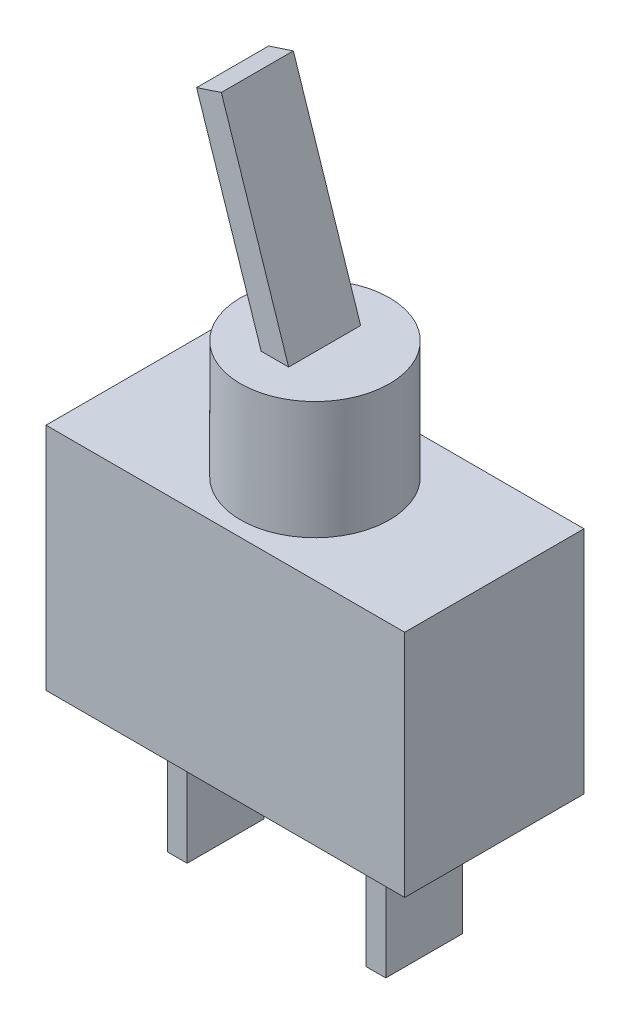
ISO-10303-21;
HEADER;
FILE_DESCRIPTION(('STEP AP214'),'2;1');
FILE_NAME('part.step','',(''),(''),'','','');
FILE_SCHEMA(('AUTOMOTIVE_DESIGN { 1 0 10303 214 1 1 1 1 }'));
ENDSEC;
DATA;
#1=APPLICATION_CONTEXT('core data for automotive mechanical design processes');
#2=APPLICATION_PROTOCOL_DEFINITION('international standard','automotive_design',2000,#1);
#3=PRODUCT_CONTEXT('',#1,'mechanical');
#4=PRODUCT('Part','Part','',(#3));
#5=PRODUCT_RELATED_PRODUCT_CATEGORY('part','',(#4));
#6=PRODUCT_DEFINITION_FORMATION('','',#4);
#7=PRODUCT_DEFINITION_CONTEXT('part definition',#1,'design');
#8=PRODUCT_DEFINITION('design','',#6,#7);
#9=PRODUCT_DEFINITION_SHAPE('','',#8);
#10=(LENGTH_UNIT() NAMED_UNIT(*) SI_UNIT(.MILLI.,.METRE.));
#11=(NAMED_UNIT(*) PLANE_ANGLE_UNIT() SI_UNIT($,.RADIAN.));
#12=(NAMED_UNIT(*) SI_UNIT($,.STERADIAN.) SOLID_ANGLE_UNIT());
#13=UNCERTAINTY_MEASURE_WITH_UNIT(LENGTH_MEASURE(1.E-05),#10,'distance_accuracy_value','');
#14=(GEOMETRIC_REPRESENTATION_CONTEXT(3) GLOBAL_UNCERTAINTY_ASSIGNED_CONTEXT((#13)) GLOBAL_UNIT_ASSIGNED_CONTEXT((#10,
#11,#12)) REPRESENTATION_CONTEXT('',''));
#15=CARTESIAN_POINT('',(0.,0.,0.));
#16=DIRECTION('',(0.,0.,1.));
#17=DIRECTION('',(1.,0.,0.));
#18=AXIS2_PLACEMENT_3D('',#15,#16,#17);
#19=CARTESIAN_POINT('',(-14.445,-9.25,7.22));
#20=DIRECTION('',(0.,1.,0.));
#21=DIRECTION('',(0.,0.,1.));
#22=AXIS2_PLACEMENT_3D('',#19,#20,#21);
#23=PLANE('',#22);
#24=DIRECTION('',(-1.,0.,0.));
#25=VECTOR('',#24,1.);
#26=CARTESIAN_POINT('',(7.2,-9.25,3.1));
#27=LINE('',#26,#25);
#28=CARTESIAN_POINT('',(8.8,-9.25,3.1));
#29=VERTEX_POINT('',#28);
#30=CARTESIAN_POINT('',(7.2,-9.25,3.1));
#31=VERTEX_POINT('',#30);
#32=EDGE_CURVE('E245',#29,#31,#27,.T.);
#33=ORIENTED_EDGE('',*,*,#32,.F.);
#34=DIRECTION('',(0.,0.,-1.));
#35=VECTOR('',#34,1.);
#36=CARTESIAN_POINT('',(8.8,-9.25,3.1));
#37=LINE('',#36,#35);
#38=CARTESIAN_POINT('',(8.8,-9.25,-3.1));
#39=VERTEX_POINT('',#38);
#40=EDGE_CURVE('E211',#29,#39,#37,.T.);
#41=ORIENTED_EDGE('',*,*,#40,.T.);
#42=DIRECTION('',(-1.,0.,0.));
#43=VECTOR('',#42,1.);
#44=CARTESIAN_POINT('',(7.2,-9.25,-3.1));
#45=LINE('',#44,#43);
#46=CARTESIAN_POINT('',(7.2,-9.25,-3.1));
#47=VERTEX_POINT('',#46);
#48=EDGE_CURVE('E233',#39,#47,#45,.T.);
#49=ORIENTED_EDGE('',*,*,#48,.T.);
#50=DIRECTION('',(0.,0.,-1.));
#51=VECTOR('',#50,1.);
#52=CARTESIAN_POINT('',(7.2,-9.25,3.1));
#53=LINE('',#52,#51);
#54=EDGE_CURVE('E215',#31,#47,#53,.T.);
#55=ORIENTED_EDGE('',*,*,#54,.F.);
#56=EDGE_LOOP('',(#33,#41,#49,#55));
#57=FACE_BOUND('',#56,.T.);
#58=DIRECTION('',(1.,0.,0.));
#59=VECTOR('',#58,1.);
#60=CARTESIAN_POINT('',(-14.445,-9.25,-7.22));
#61=LINE('',#60,#59);
#62=CARTESIAN_POINT('',(-14.445,-9.25,-7.22));
#63=VERTEX_POINT('',#62);
#64=CARTESIAN_POINT('',(14.445,-9.25,-7.22));
#65=VERTEX_POINT('',#64);
#66=EDGE_CURVE('E287',#63,#65,#61,.T.);
#67=ORIENTED_EDGE('',*,*,#66,.T.);
#68=DIRECTION('',(0.,0.,-1.));
#69=VECTOR('',#68,1.);
#70=CARTESIAN_POINT('',(14.445,-9.25,7.22));
#71=LINE('',#70,#69);
#72=CARTESIAN_POINT('',(14.445,-9.25,7.22));
#73=VERTEX_POINT('',#72);
#74=EDGE_CURVE('E296',#73,#65,#71,.T.);
#75=ORIENTED_EDGE('',*,*,#74,.F.);
#76=DIRECTION('',(1.,0.,0.));
#77=VECTOR('',#76,1.);
#78=CARTESIAN_POINT('',(-14.445,-9.25,7.22));
#79=LINE('',#78,#77);
#80=CARTESIAN_POINT('',(-14.445,-9.25,7.22));
#81=VERTEX_POINT('',#80);
#82=EDGE_CURVE('E293',#81,#73,#79,.T.);
#83=ORIENTED_EDGE('',*,*,#82,.F.);
#84=DIRECTION('',(0.,0.,-1.));
#85=VECTOR('',#84,1.);
#86=CARTESIAN_POINT('',(-14.445,-9.25,7.22));
#87=LINE('',#86,#85);
#88=EDGE_CURVE('E311',#81,#63,#87,.T.);
#89=ORIENTED_EDGE('',*,*,#88,.T.);
#90=EDGE_LOOP('',(#67,#75,#83,#89));
#91=FACE_BOUND('',#90,.T.);
#92=DIRECTION('',(-1.,0.,0.));
#93=VECTOR('',#92,1.);
#94=CARTESIAN_POINT('',(-8.8,-9.25,3.1));
#95=LINE('',#94,#93);
#96=CARTESIAN_POINT('',(-7.2,-9.25,3.1));
#97=VERTEX_POINT('',#96);
#98=CARTESIAN_POINT('',(-8.8,-9.25,3.1));
#99=VERTEX_POINT('',#98);
#100=EDGE_CURVE('E161',#97,#99,#95,.T.);
#101=ORIENTED_EDGE('',*,*,#100,.F.);
#102=DIRECTION('',(0.,0.,-1.));
#103=VECTOR('',#102,1.);
#104=CARTESIAN_POINT('',(-7.2,-9.25,3.1));
#105=LINE('',#104,#103);
#106=CARTESIAN_POINT('',(-7.2,-9.25,-3.1));
#107=VERTEX_POINT('',#106);
#108=EDGE_CURVE('E173',#97,#107,#105,.T.);
#109=ORIENTED_EDGE('',*,*,#108,.T.);
#110=DIRECTION('',(-1.,0.,0.));
#111=VECTOR('',#110,1.);
#112=CARTESIAN_POINT('',(-8.8,-9.25,-3.1));
#113=LINE('',#112,#111);
#114=CARTESIAN_POINT('',(-8.8,-9.25,-3.1));
#115=VERTEX_POINT('',#114);
#116=EDGE_CURVE('E195',#107,#115,#113,.T.);
#117=ORIENTED_EDGE('',*,*,#116,.T.);
#118=DIRECTION('',(0.,0.,-1.));
#119=VECTOR('',#118,1.);
#120=CARTESIAN_POINT('',(-8.8,-9.25,3.1));
#121=LINE('',#120,#119);
#122=EDGE_CURVE('E181',#99,#115,#121,.T.);
#123=ORIENTED_EDGE('',*,*,#122,.F.);
#124=EDGE_LOOP('',(#101,#109,#117,#123));
#125=FACE_BOUND('',#124,.T.);
#126=ADVANCED_FACE('F45',(#57,#91,#125),#23,.F.);
#127=CARTESIAN_POINT('',(0.,18.75,0.));
#128=DIRECTION('',(0.,1.,0.));
#129=DIRECTION('',(0.,0.,1.));
#130=AXIS2_PLACEMENT_3D('',#127,#128,#129);
#131=PLANE('',#130);
#132=CARTESIAN_POINT('',(0.,18.75,0.));
#133=DIRECTION('',(0.,1.,0.));
#134=DIRECTION('',(0.,0.,1.));
#135=AXIS2_PLACEMENT_3D('',#132,#133,#134);
#136=CIRCLE('',#135,6.);
#137=CARTESIAN_POINT('',(0.,18.75,6.));
#138=VERTEX_POINT('',#137);
#139=EDGE_CURVE('E277',#138,#138,#136,.T.);
#140=ORIENTED_EDGE('',*,*,#139,.T.);
#141=EDGE_LOOP('',(#140));
#142=FACE_BOUND('',#141,.T.);
#143=DIRECTION('',(0.,0.,1.));
#144=VECTOR('',#143,1.);
#145=CARTESIAN_POINT('',(0.774833820947923,18.75,0.));
#146=LINE('',#145,#144);
#147=CARTESIAN_POINT('',(0.774833820947923,18.75,-2.9));
#148=VERTEX_POINT('',#147);
#149=CARTESIAN_POINT('',(0.774833820947923,18.75,2.9));
#150=VERTEX_POINT('',#149);
#151=EDGE_CURVE('E331',#148,#150,#146,.T.);
#152=ORIENTED_EDGE('',*,*,#151,.T.);
#153=DIRECTION('',(-1.,0.,0.));
#154=VECTOR('',#153,1.);
#155=CARTESIAN_POINT('',(0.,18.75,2.9));
#156=LINE('',#155,#154);
#157=CARTESIAN_POINT('',(-1.43369865418373,18.75,2.9));
#158=VERTEX_POINT('',#157);
#159=EDGE_CURVE('E11',#150,#158,#156,.T.);
#160=ORIENTED_EDGE('',*,*,#159,.T.);
#161=DIRECTION('',(0.,0.,-1.));
#162=VECTOR('',#161,1.);
#163=CARTESIAN_POINT('',(-1.43369865418373,18.75,0.));
#164=LINE('',#163,#162);
#165=CARTESIAN_POINT('',(-1.43369865418373,18.75,-2.9));
#166=VERTEX_POINT('',#165);
#167=EDGE_CURVE('E54',#158,#166,#164,.T.);
#168=ORIENTED_EDGE('',*,*,#167,.T.);
#169=DIRECTION('',(-1.,0.,0.));
#170=VECTOR('',#169,1.);
#171=CARTESIAN_POINT('',(0.,18.75,-2.9));
#172=LINE('',#171,#170);
#173=EDGE_CURVE('E327',#148,#166,#172,.T.);
#174=ORIENTED_EDGE('',*,*,#173,.F.);
#175=EDGE_LOOP('',(#152,#160,#168,#174));
#176=FACE_BOUND('',#175,.T.);
#177=ADVANCED_FACE('F336',(#142,#176),#131,.T.);
#178=CARTESIAN_POINT('',(14.445,-9.25,7.22));
#179=DIRECTION('',(-1.,0.,0.));
#180=DIRECTION('',(0.,0.,1.));
#181=AXIS2_PLACEMENT_3D('',#178,#179,#180);
#182=PLANE('',#181);
#183=DIRECTION('',(0.,1.,0.));
#184=VECTOR('',#183,1.);
#185=CARTESIAN_POINT('',(14.445,-9.25,-7.22));
#186=LINE('',#185,#184);
#187=CARTESIAN_POINT('',(14.445,9.25,-7.22));
#188=VERTEX_POINT('',#187);
#189=EDGE_CURVE('E281',#65,#188,#186,.T.);
#190=ORIENTED_EDGE('',*,*,#189,.T.);
#191=DIRECTION('',(0.,0.,-1.));
#192=VECTOR('',#191,1.);
#193=CARTESIAN_POINT('',(14.445,9.25,7.22));
#194=LINE('',#193,#192);
#195=CARTESIAN_POINT('',(14.445,9.25,7.22));
#196=VERTEX_POINT('',#195);
#197=EDGE_CURVE('E319',#196,#188,#194,.T.);
#198=ORIENTED_EDGE('',*,*,#197,.F.);
#199=DIRECTION('',(0.,1.,0.));
#200=VECTOR('',#199,1.);
#201=CARTESIAN_POINT('',(14.445,-9.25,7.22));
#202=LINE('',#201,#200);
#203=EDGE_CURVE('E282',#73,#196,#202,.T.);
#204=ORIENTED_EDGE('',*,*,#203,.F.);
#205=ORIENTED_EDGE('',*,*,#74,.T.);
#206=EDGE_LOOP('',(#190,#198,#204,#205));
#207=FACE_BOUND('',#206,.T.);
#208=ADVANCED_FACE('F47',(#207),#182,.F.);
#209=CARTESIAN_POINT('',(-14.445,9.25,7.22));
#210=DIRECTION('',(0.,-1.,0.));
#211=DIRECTION('',(0.,0.,-1.));
#212=AXIS2_PLACEMENT_3D('',#209,#210,#211);
#213=PLANE('',#212);
#214=CARTESIAN_POINT('',(0.,9.25,0.));
#215=DIRECTION('',(0.,-1.,0.));
#216=DIRECTION('',(0.,0.,-1.));
#217=AXIS2_PLACEMENT_3D('',#214,#215,#216);
#218=CIRCLE('',#217,6.);
#219=CARTESIAN_POINT('',(0.,9.25,-6.));
#220=VERTEX_POINT('',#219);
#221=EDGE_CURVE('E323',#220,#220,#218,.F.);
#222=ORIENTED_EDGE('',*,*,#221,.F.);
#223=EDGE_LOOP('',(#222));
#224=FACE_BOUND('',#223,.T.);
#225=DIRECTION('',(-1.,0.,0.));
#226=VECTOR('',#225,1.);
#227=CARTESIAN_POINT('',(-14.445,9.25,-7.22));
#228=LINE('',#227,#226);
#229=CARTESIAN_POINT('',(-14.445,9.25,-7.22));
#230=VERTEX_POINT('',#229);
#231=EDGE_CURVE('E300',#188,#230,#228,.T.);
#232=ORIENTED_EDGE('',*,*,#231,.T.);
#233=DIRECTION('',(0.,0.,-1.));
#234=VECTOR('',#233,1.);
#235=CARTESIAN_POINT('',(-14.445,9.25,7.22));
#236=LINE('',#235,#234);
#237=CARTESIAN_POINT('',(-14.445,9.25,7.22));
#238=VERTEX_POINT('',#237);
#239=EDGE_CURVE('E315',#238,#230,#236,.T.);
#240=ORIENTED_EDGE('',*,*,#239,.F.);
#241=DIRECTION('',(-1.,0.,0.));
#242=VECTOR('',#241,1.);
#243=CARTESIAN_POINT('',(-14.445,9.25,7.22));
#244=LINE('',#243,#242);
#245=EDGE_CURVE('E286',#196,#238,#244,.T.);
#246=ORIENTED_EDGE('',*,*,#245,.F.);
#247=ORIENTED_EDGE('',*,*,#197,.T.);
#248=EDGE_LOOP('',(#232,#240,#246,#247));
#249=FACE_BOUND('',#248,.T.);
#250=ADVANCED_FACE('F385',(#224,#249),#213,.F.);
#251=CARTESIAN_POINT('',(-14.445,-9.25,7.22));
#252=DIRECTION('',(1.,0.,0.));
#253=DIRECTION('',(0.,0.,-1.));
#254=AXIS2_PLACEMENT_3D('',#251,#252,#253);
#255=PLANE('',#254);
#256=DIRECTION('',(0.,-1.,0.));
#257=VECTOR('',#256,1.);
#258=CARTESIAN_POINT('',(-14.445,-9.25,-7.22));
#259=LINE('',#258,#257);
#260=EDGE_CURVE('E303',#230,#63,#259,.T.);
#261=ORIENTED_EDGE('',*,*,#260,.T.);
#262=ORIENTED_EDGE('',*,*,#88,.F.);
#263=DIRECTION('',(0.,-1.,0.));
#264=VECTOR('',#263,1.);
#265=CARTESIAN_POINT('',(-14.445,-9.25,7.22));
#266=LINE('',#265,#264);
#267=EDGE_CURVE('E290',#238,#81,#266,.T.);
#268=ORIENTED_EDGE('',*,*,#267,.F.);
#269=ORIENTED_EDGE('',*,*,#239,.T.);
#270=EDGE_LOOP('',(#261,#262,#268,#269));
#271=FACE_BOUND('',#270,.T.);
#272=ADVANCED_FACE('F382',(#271),#255,.F.);
#273=CARTESIAN_POINT('',(0.,0.,7.22));
#274=DIRECTION('',(0.,0.,-1.));
#275=DIRECTION('',(-1.,0.,0.));
#276=AXIS2_PLACEMENT_3D('',#273,#274,#275);
#277=PLANE('',#276);
#278=ORIENTED_EDGE('',*,*,#203,.T.);
#279=ORIENTED_EDGE('',*,*,#245,.T.);
#280=ORIENTED_EDGE('',*,*,#267,.T.);
#281=ORIENTED_EDGE('',*,*,#82,.T.);
#282=EDGE_LOOP('',(#278,#279,#280,#281));
#283=FACE_BOUND('',#282,.T.);
#284=ADVANCED_FACE('F384',(#283),#277,.F.);
#285=CARTESIAN_POINT('',(0.,0.,-7.22));
#286=DIRECTION('',(0.,0.,-1.));
#287=DIRECTION('',(-1.,0.,0.));
#288=AXIS2_PLACEMENT_3D('',#285,#286,#287);
#289=PLANE('',#288);
#290=ORIENTED_EDGE('',*,*,#189,.F.);
#291=ORIENTED_EDGE('',*,*,#66,.F.);
#292=ORIENTED_EDGE('',*,*,#260,.F.);
#293=ORIENTED_EDGE('',*,*,#231,.F.);
#294=EDGE_LOOP('',(#290,#291,#292,#293));
#295=FACE_BOUND('',#294,.T.);
#296=ADVANCED_FACE('F380',(#295),#289,.T.);
#297=CARTESIAN_POINT('',(0.,18.75,0.));
#298=DIRECTION('',(0.,-1.,0.));
#299=DIRECTION('',(0.,0.,-1.));
#300=AXIS2_PLACEMENT_3D('',#297,#298,#299);
#301=CYLINDRICAL_SURFACE('',#300,6.);
#302=ORIENTED_EDGE('',*,*,#139,.F.);
#303=EDGE_LOOP('',(#302));
#304=FACE_BOUND('',#303,.T.);
#305=ORIENTED_EDGE('',*,*,#221,.T.);
#306=EDGE_LOOP('',(#305));
#307=FACE_BOUND('',#306,.T.);
#308=ADVANCED_FACE('F412',(#304,#307),#301,.T.);
#309=CARTESIAN_POINT('',(-6.63631505505537,34.5426668367489,2.9));
#310=DIRECTION('',(0.949788951991817,0.312891269731652,0.));
#311=DIRECTION('',(-0.312891269731652,0.949788951991817,0.));
#312=AXIS2_PLACEMENT_3D('',#309,#310,#311);
#313=PLANE('',#312);
#314=ORIENTED_EDGE('',*,*,#167,.F.);
#315=DIRECTION('',(0.312891269731652,-0.949788951991817,0.));
#316=VECTOR('',#315,1.);
#317=CARTESIAN_POINT('',(-6.63631505505537,34.5426668367489,2.9));
#318=LINE('',#317,#316);
#319=CARTESIAN_POINT('',(-6.63631505505537,34.5426668367489,2.9));
#320=VERTEX_POINT('',#319);
#321=EDGE_CURVE('E250',#320,#158,#318,.T.);
#322=ORIENTED_EDGE('',*,*,#321,.F.);
#323=DIRECTION('',(0.,0.,-1.));
#324=VECTOR('',#323,1.);
#325=CARTESIAN_POINT('',(-6.63631505505537,34.5426668367489,2.9));
#326=LINE('',#325,#324);
#327=CARTESIAN_POINT('',(-6.63631505505537,34.5426668367489,-2.9));
#328=VERTEX_POINT('',#327);
#329=EDGE_CURVE('E261',#320,#328,#326,.T.);
#330=ORIENTED_EDGE('',*,*,#329,.T.);
#331=DIRECTION('',(0.312891269731652,-0.949788951991817,0.));
#332=VECTOR('',#331,1.);
#333=CARTESIAN_POINT('',(-6.63631505505537,34.5426668367489,-2.9));
#334=LINE('',#333,#332);
#335=EDGE_CURVE('E180',#328,#166,#334,.T.);
#336=ORIENTED_EDGE('',*,*,#335,.T.);
#337=EDGE_LOOP('',(#314,#322,#330,#336));
#338=FACE_BOUND('',#337,.T.);
#339=ADVANCED_FACE('F346',(#338),#313,.F.);
#340=CARTESIAN_POINT('',(0.986,18.109,2.9));
#341=DIRECTION('',(-0.949788951991817,-0.312891269731652,0.));
#342=DIRECTION('',(0.312891269731652,-0.949788951991817,0.));
#343=AXIS2_PLACEMENT_3D('',#340,#341,#342);
#344=PLANE('',#343);
#345=ORIENTED_EDGE('',*,*,#151,.F.);
#346=DIRECTION('',(-0.312891269731652,0.949788951991817,0.));
#347=VECTOR('',#346,1.);
#348=CARTESIAN_POINT('',(0.986,18.109,-2.9));
#349=LINE('',#348,#347);
#350=CARTESIAN_POINT('',(-4.644,35.199,-2.9));
#351=VERTEX_POINT('',#350);
#352=EDGE_CURVE('E265',#148,#351,#349,.T.);
#353=ORIENTED_EDGE('',*,*,#352,.T.);
#354=DIRECTION('',(0.,0.,-1.));
#355=VECTOR('',#354,1.);
#356=CARTESIAN_POINT('',(-4.644,35.199,2.9));
#357=LINE('',#356,#355);
#358=CARTESIAN_POINT('',(-4.644,35.199,2.9));
#359=VERTEX_POINT('',#358);
#360=EDGE_CURVE('E273',#359,#351,#357,.T.);
#361=ORIENTED_EDGE('',*,*,#360,.F.);
#362=DIRECTION('',(-0.312891269731652,0.949788951991817,0.));
#363=VECTOR('',#362,1.);
#364=CARTESIAN_POINT('',(0.986,18.109,2.9));
#365=LINE('',#364,#363);
#366=EDGE_CURVE('E254',#150,#359,#365,.T.);
#367=ORIENTED_EDGE('',*,*,#366,.F.);
#368=EDGE_LOOP('',(#345,#353,#361,#367));
#369=FACE_BOUND('',#368,.T.);
#370=ADVANCED_FACE('F354',(#369),#344,.F.);
#371=CARTESIAN_POINT('',(-4.644,35.199,2.9));
#372=DIRECTION('',(0.312891269731651,-0.949788951991818,0.));
#373=DIRECTION('',(0.949788951991818,0.312891269731651,0.));
#374=AXIS2_PLACEMENT_3D('',#371,#372,#373);
#375=PLANE('',#374);
#376=DIRECTION('',(-0.949788951991818,-0.312891269731651,0.));
#377=VECTOR('',#376,1.);
#378=CARTESIAN_POINT('',(-4.644,35.199,-2.9));
#379=LINE('',#378,#377);
#380=EDGE_CURVE('E255',#351,#328,#379,.T.);
#381=ORIENTED_EDGE('',*,*,#380,.T.);
#382=ORIENTED_EDGE('',*,*,#329,.F.);
#383=DIRECTION('',(-0.949788951991818,-0.312891269731651,0.));
#384=VECTOR('',#383,1.);
#385=CARTESIAN_POINT('',(-4.644,35.199,2.9));
#386=LINE('',#385,#384);
#387=EDGE_CURVE('E258',#359,#320,#386,.T.);
#388=ORIENTED_EDGE('',*,*,#387,.F.);
#389=ORIENTED_EDGE('',*,*,#360,.T.);
#390=EDGE_LOOP('',(#381,#382,#388,#389));
#391=FACE_BOUND('',#390,.T.);
#392=ADVANCED_FACE('F350',(#391),#375,.F.);
#393=CARTESIAN_POINT('',(0.,0.,2.9));
#394=DIRECTION('',(0.,0.,-1.));
#395=DIRECTION('',(-1.,0.,0.));
#396=AXIS2_PLACEMENT_3D('',#393,#394,#395);
#397=PLANE('',#396);
#398=ORIENTED_EDGE('',*,*,#159,.F.);
#399=ORIENTED_EDGE('',*,*,#366,.T.);
#400=ORIENTED_EDGE('',*,*,#387,.T.);
#401=ORIENTED_EDGE('',*,*,#321,.T.);
#402=EDGE_LOOP('',(#398,#399,#400,#401));
#403=FACE_BOUND('',#402,.T.);
#404=ADVANCED_FACE('F356',(#403),#397,.F.);
#405=CARTESIAN_POINT('',(0.,0.,-2.9));
#406=DIRECTION('',(0.,0.,-1.));
#407=DIRECTION('',(-1.,0.,0.));
#408=AXIS2_PLACEMENT_3D('',#405,#406,#407);
#409=PLANE('',#408);
#410=ORIENTED_EDGE('',*,*,#352,.F.);
#411=ORIENTED_EDGE('',*,*,#173,.T.);
#412=ORIENTED_EDGE('',*,*,#335,.F.);
#413=ORIENTED_EDGE('',*,*,#380,.F.);
#414=EDGE_LOOP('',(#410,#411,#412,#413));
#415=FACE_BOUND('',#414,.T.);
#416=ADVANCED_FACE('F344',(#415),#409,.T.);
#417=CARTESIAN_POINT('',(8.8,-19.75,3.1));
#418=DIRECTION('',(-1.,0.,0.));
#419=DIRECTION('',(0.,0.,1.));
#420=AXIS2_PLACEMENT_3D('',#417,#418,#419);
#421=PLANE('',#420);
#422=DIRECTION('',(0.,1.,0.));
#423=VECTOR('',#422,1.);
#424=CARTESIAN_POINT('',(8.8,-19.75,-3.1));
#425=LINE('',#424,#423);
#426=CARTESIAN_POINT('',(8.8,-19.75,-3.1));
#427=VERTEX_POINT('',#426);
#428=EDGE_CURVE('E196',#427,#39,#425,.T.);
#429=ORIENTED_EDGE('',*,*,#428,.T.);
#430=ORIENTED_EDGE('',*,*,#40,.F.);
#431=DIRECTION('',(0.,1.,0.));
#432=VECTOR('',#431,1.);
#433=CARTESIAN_POINT('',(8.8,-19.75,3.1));
#434=LINE('',#433,#432);
#435=CARTESIAN_POINT('',(8.8,-19.75,3.1));
#436=VERTEX_POINT('',#435);
#437=EDGE_CURVE('E230',#436,#29,#434,.T.);
#438=ORIENTED_EDGE('',*,*,#437,.F.);
#439=DIRECTION('',(0.,0.,-1.));
#440=VECTOR('',#439,1.);
#441=CARTESIAN_POINT('',(8.8,-19.75,3.1));
#442=LINE('',#441,#440);
#443=EDGE_CURVE('E222',#436,#427,#442,.T.);
#444=ORIENTED_EDGE('',*,*,#443,.T.);
#445=EDGE_LOOP('',(#429,#430,#438,#444));
#446=FACE_BOUND('',#445,.T.);
#447=ADVANCED_FACE('F363',(#446),#421,.F.);
#448=CARTESIAN_POINT('',(7.2,-19.75,3.1));
#449=DIRECTION('',(1.,0.,0.));
#450=DIRECTION('',(0.,0.,-1.));
#451=AXIS2_PLACEMENT_3D('',#448,#449,#450);
#452=PLANE('',#451);
#453=DIRECTION('',(0.,-1.,0.));
#454=VECTOR('',#453,1.);
#455=CARTESIAN_POINT('',(7.2,-19.75,-3.1));
#456=LINE('',#455,#454);
#457=CARTESIAN_POINT('',(7.2,-19.75,-3.1));
#458=VERTEX_POINT('',#457);
#459=EDGE_CURVE('E69',#47,#458,#456,.T.);
#460=ORIENTED_EDGE('',*,*,#459,.T.);
#461=DIRECTION('',(0.,0.,-1.));
#462=VECTOR('',#461,1.);
#463=CARTESIAN_POINT('',(7.2,-19.75,3.1));
#464=LINE('',#463,#462);
#465=CARTESIAN_POINT('',(7.2,-19.75,3.1));
#466=VERTEX_POINT('',#465);
#467=EDGE_CURVE('E218',#466,#458,#464,.T.);
#468=ORIENTED_EDGE('',*,*,#467,.F.);
#469=DIRECTION('',(0.,-1.,0.));
#470=VECTOR('',#469,1.);
#471=CARTESIAN_POINT('',(7.2,-19.75,3.1));
#472=LINE('',#471,#470);
#473=EDGE_CURVE('E242',#31,#466,#472,.T.);
#474=ORIENTED_EDGE('',*,*,#473,.F.);
#475=ORIENTED_EDGE('',*,*,#54,.T.);
#476=EDGE_LOOP('',(#460,#468,#474,#475));
#477=FACE_BOUND('',#476,.T.);
#478=ADVANCED_FACE('F451',(#477),#452,.F.);
#479=CARTESIAN_POINT('',(7.2,-19.75,3.1));
#480=DIRECTION('',(0.,1.,0.));
#481=DIRECTION('',(0.,0.,1.));
#482=AXIS2_PLACEMENT_3D('',#479,#480,#481);
#483=PLANE('',#482);
#484=DIRECTION('',(1.,0.,0.));
#485=VECTOR('',#484,1.);
#486=CARTESIAN_POINT('',(7.2,-19.75,-3.1));
#487=LINE('',#486,#485);
#488=EDGE_CURVE('E227',#458,#427,#487,.T.);
#489=ORIENTED_EDGE('',*,*,#488,.T.);
#490=ORIENTED_EDGE('',*,*,#443,.F.);
#491=DIRECTION('',(1.,0.,0.));
#492=VECTOR('',#491,1.);
#493=CARTESIAN_POINT('',(7.2,-19.75,3.1));
#494=LINE('',#493,#492);
#495=EDGE_CURVE('E226',#466,#436,#494,.T.);
#496=ORIENTED_EDGE('',*,*,#495,.F.);
#497=ORIENTED_EDGE('',*,*,#467,.T.);
#498=EDGE_LOOP('',(#489,#490,#496,#497));
#499=FACE_BOUND('',#498,.T.);
#500=ADVANCED_FACE('F461',(#499),#483,.F.);
#501=CARTESIAN_POINT('',(0.,0.,3.1));
#502=DIRECTION('',(0.,0.,-1.));
#503=DIRECTION('',(-1.,0.,0.));
#504=AXIS2_PLACEMENT_3D('',#501,#502,#503);
#505=PLANE('',#504);
#506=ORIENTED_EDGE('',*,*,#437,.T.);
#507=ORIENTED_EDGE('',*,*,#32,.T.);
#508=ORIENTED_EDGE('',*,*,#473,.T.);
#509=ORIENTED_EDGE('',*,*,#495,.T.);
#510=EDGE_LOOP('',(#506,#507,#508,#509));
#511=FACE_BOUND('',#510,.T.);
#512=ADVANCED_FACE('F471',(#511),#505,.F.);
#513=CARTESIAN_POINT('',(0.,0.,-3.1));
#514=DIRECTION('',(0.,0.,-1.));
#515=DIRECTION('',(-1.,0.,0.));
#516=AXIS2_PLACEMENT_3D('',#513,#514,#515);
#517=PLANE('',#516);
#518=ORIENTED_EDGE('',*,*,#428,.F.);
#519=ORIENTED_EDGE('',*,*,#488,.F.);
#520=ORIENTED_EDGE('',*,*,#459,.F.);
#521=ORIENTED_EDGE('',*,*,#48,.F.);
#522=EDGE_LOOP('',(#518,#519,#520,#521));
#523=FACE_BOUND('',#522,.T.);
#524=ADVANCED_FACE('F481',(#523),#517,.T.);
#525=CARTESIAN_POINT('',(-7.2,-19.75,3.1));
#526=DIRECTION('',(-1.,0.,0.));
#527=DIRECTION('',(0.,0.,1.));
#528=AXIS2_PLACEMENT_3D('',#525,#526,#527);
#529=PLANE('',#528);
#530=DIRECTION('',(0.,1.,0.));
#531=VECTOR('',#530,1.);
#532=CARTESIAN_POINT('',(-7.2,-19.75,-3.1));
#533=LINE('',#532,#531);
#534=CARTESIAN_POINT('',(-7.2,-19.75,-3.1));
#535=VERTEX_POINT('',#534);
#536=EDGE_CURVE('E176',#535,#107,#533,.T.);
#537=ORIENTED_EDGE('',*,*,#536,.T.);
#538=ORIENTED_EDGE('',*,*,#108,.F.);
#539=DIRECTION('',(0.,1.,0.));
#540=VECTOR('',#539,1.);
#541=CARTESIAN_POINT('',(-7.2,-19.75,3.1));
#542=LINE('',#541,#540);
#543=CARTESIAN_POINT('',(-7.2,-19.75,3.1));
#544=VERTEX_POINT('',#543);
#545=EDGE_CURVE('E157',#544,#97,#542,.T.);
#546=ORIENTED_EDGE('',*,*,#545,.F.);
#547=DIRECTION('',(0.,0.,-1.));
#548=VECTOR('',#547,1.);
#549=CARTESIAN_POINT('',(-7.2,-19.75,3.1));
#550=LINE('',#549,#548);
#551=EDGE_CURVE('E192',#544,#535,#550,.T.);
#552=ORIENTED_EDGE('',*,*,#551,.T.);
#553=EDGE_LOOP('',(#537,#538,#546,#552));
#554=FACE_BOUND('',#553,.T.);
#555=ADVANCED_FACE('F174',(#554),#529,.F.);
#556=CARTESIAN_POINT('',(-8.8,-19.75,3.1));
#557=DIRECTION('',(1.,0.,0.));
#558=DIRECTION('',(0.,0.,-1.));
#559=AXIS2_PLACEMENT_3D('',#556,#557,#558);
#560=PLANE('',#559);
#561=DIRECTION('',(0.,-1.,0.));
#562=VECTOR('',#561,1.);
#563=CARTESIAN_POINT('',(-8.8,-19.75,-3.1));
#564=LINE('',#563,#562);
#565=CARTESIAN_POINT('',(-8.8,-19.75,-3.1));
#566=VERTEX_POINT('',#565);
#567=EDGE_CURVE('E61',#115,#566,#564,.T.);
#568=ORIENTED_EDGE('',*,*,#567,.T.);
#569=DIRECTION('',(0.,0.,-1.));
#570=VECTOR('',#569,1.);
#571=CARTESIAN_POINT('',(-8.8,-19.75,3.1));
#572=LINE('',#571,#570);
#573=CARTESIAN_POINT('',(-8.8,-19.75,3.1));
#574=VERTEX_POINT('',#573);
#575=EDGE_CURVE('E205',#574,#566,#572,.T.);
#576=ORIENTED_EDGE('',*,*,#575,.F.);
#577=DIRECTION('',(0.,-1.,0.));
#578=VECTOR('',#577,1.);
#579=CARTESIAN_POINT('',(-8.8,-19.75,3.1));
#580=LINE('',#579,#578);
#581=EDGE_CURVE('E185',#99,#574,#580,.T.);
#582=ORIENTED_EDGE('',*,*,#581,.F.);
#583=ORIENTED_EDGE('',*,*,#122,.T.);
#584=EDGE_LOOP('',(#568,#576,#582,#583));
#585=FACE_BOUND('',#584,.T.);
#586=ADVANCED_FACE('F498',(#585),#560,.F.);
#587=CARTESIAN_POINT('',(-8.8,-19.75,3.1));
#588=DIRECTION('',(0.,1.,0.));
#589=DIRECTION('',(0.,0.,1.));
#590=AXIS2_PLACEMENT_3D('',#587,#588,#589);
#591=PLANE('',#590);
#592=DIRECTION('',(1.,0.,0.));
#593=VECTOR('',#592,1.);
#594=CARTESIAN_POINT('',(-8.8,-19.75,-3.1));
#595=LINE('',#594,#593);
#596=EDGE_CURVE('E169',#566,#535,#595,.T.);
#597=ORIENTED_EDGE('',*,*,#596,.T.);
#598=ORIENTED_EDGE('',*,*,#551,.F.);
#599=DIRECTION('',(1.,0.,0.));
#600=VECTOR('',#599,1.);
#601=CARTESIAN_POINT('',(-8.8,-19.75,3.1));
#602=LINE('',#601,#600);
#603=EDGE_CURVE('E164',#574,#544,#602,.T.);
#604=ORIENTED_EDGE('',*,*,#603,.F.);
#605=ORIENTED_EDGE('',*,*,#575,.T.);
#606=EDGE_LOOP('',(#597,#598,#604,#605));
#607=FACE_BOUND('',#606,.T.);
#608=ADVANCED_FACE('F507',(#607),#591,.F.);
#609=CARTESIAN_POINT('',(0.,0.,3.1));
#610=DIRECTION('',(0.,0.,-1.));
#611=DIRECTION('',(-1.,0.,0.));
#612=AXIS2_PLACEMENT_3D('',#609,#610,#611);
#613=PLANE('',#612);
#614=ORIENTED_EDGE('',*,*,#545,.T.);
#615=ORIENTED_EDGE('',*,*,#100,.T.);
#616=ORIENTED_EDGE('',*,*,#581,.T.);
#617=ORIENTED_EDGE('',*,*,#603,.T.);
#618=EDGE_LOOP('',(#614,#615,#616,#617));
#619=FACE_BOUND('',#618,.T.);
#620=ADVANCED_FACE('F159',(#619),#613,.F.);
#621=CARTESIAN_POINT('',(0.,0.,-3.1));
#622=DIRECTION('',(0.,0.,-1.));
#623=DIRECTION('',(-1.,0.,0.));
#624=AXIS2_PLACEMENT_3D('',#621,#622,#623);
#625=PLANE('',#624);
#626=ORIENTED_EDGE('',*,*,#536,.F.);
#627=ORIENTED_EDGE('',*,*,#596,.F.);
#628=ORIENTED_EDGE('',*,*,#567,.F.);
#629=ORIENTED_EDGE('',*,*,#116,.F.);
#630=EDGE_LOOP('',(#626,#627,#628,#629));
#631=FACE_BOUND('',#630,.T.);
#632=ADVANCED_FACE('F526',(#631),#625,.T.);
#633=CLOSED_SHELL('',(#126,#177,#208,#250,#272,#284,#296,#308,#339,#370,#392,#404,#416,#447,
#478,#500,#512,#524,#555,#586,#608,#620,#632));
#634=MANIFOLD_SOLID_BREP('B2',#633);
#635=ADVANCED_BREP_SHAPE_REPRESENTATION('',(#18,#634),#14);
#636=SHAPE_DEFINITION_REPRESENTATION(#9,#635);
ENDSEC;
END-ISO-10303-21;
